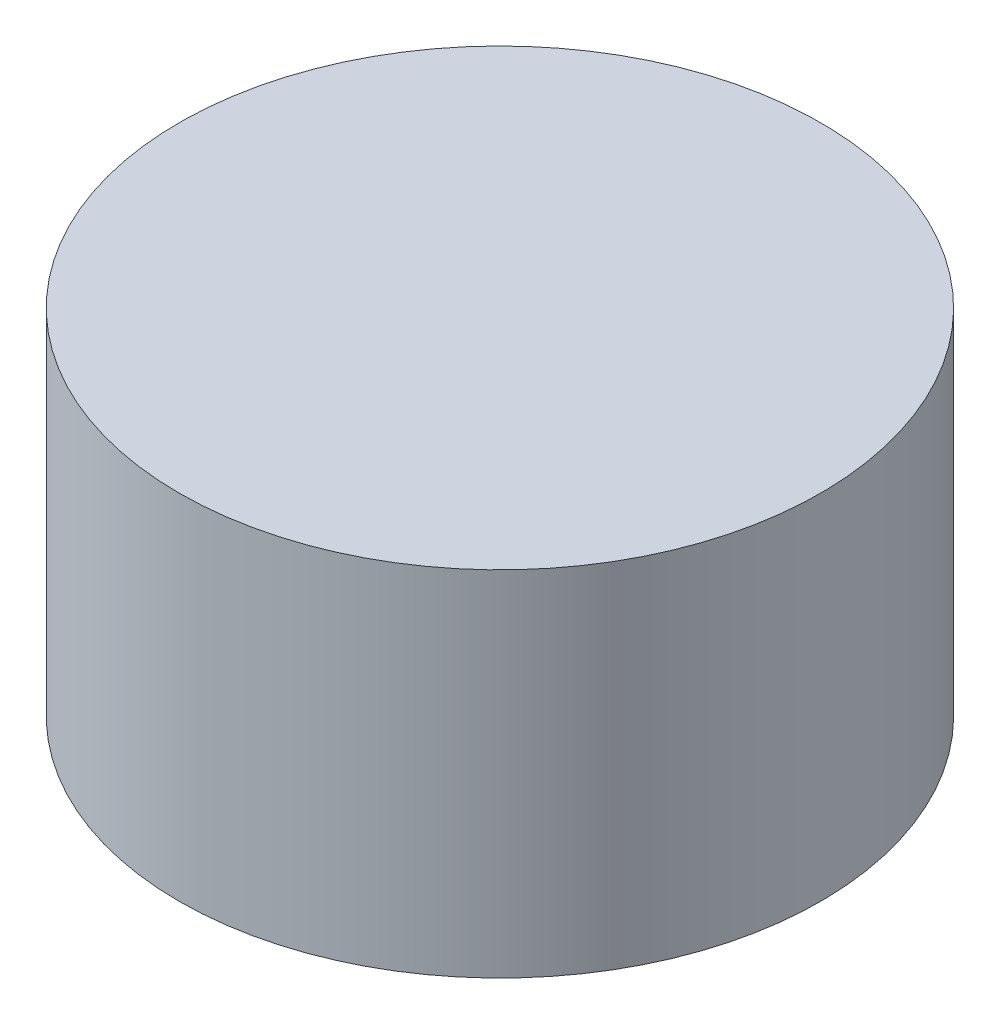
ISO-10303-21;
HEADER;
FILE_DESCRIPTION(('STEP AP214'),'2;1');
FILE_NAME('part.step','',(''),(''),'','','');
FILE_SCHEMA(('AUTOMOTIVE_DESIGN { 1 0 10303 214 1 1 1 1 }'));
ENDSEC;
DATA;
#1=APPLICATION_CONTEXT('core data for automotive mechanical design processes');
#2=APPLICATION_PROTOCOL_DEFINITION('international standard','automotive_design',2000,#1);
#3=PRODUCT_CONTEXT('',#1,'mechanical');
#4=PRODUCT('Part','Part','',(#3));
#5=PRODUCT_RELATED_PRODUCT_CATEGORY('part','',(#4));
#6=PRODUCT_DEFINITION_FORMATION('','',#4);
#7=PRODUCT_DEFINITION_CONTEXT('part definition',#1,'design');
#8=PRODUCT_DEFINITION('design','',#6,#7);
#9=PRODUCT_DEFINITION_SHAPE('','',#8);
#10=(LENGTH_UNIT() NAMED_UNIT(*) SI_UNIT(.MILLI.,.METRE.));
#11=(NAMED_UNIT(*) PLANE_ANGLE_UNIT() SI_UNIT($,.RADIAN.));
#12=(NAMED_UNIT(*) SI_UNIT($,.STERADIAN.) SOLID_ANGLE_UNIT());
#13=UNCERTAINTY_MEASURE_WITH_UNIT(LENGTH_MEASURE(1.E-05),#10,'distance_accuracy_value','');
#14=(GEOMETRIC_REPRESENTATION_CONTEXT(3) GLOBAL_UNCERTAINTY_ASSIGNED_CONTEXT((#13)) GLOBAL_UNIT_ASSIGNED_CONTEXT((#10,
#11,#12)) REPRESENTATION_CONTEXT('',''));
#15=CARTESIAN_POINT('',(0.,0.,0.));
#16=DIRECTION('',(0.,0.,1.));
#17=DIRECTION('',(1.,0.,0.));
#18=AXIS2_PLACEMENT_3D('',#15,#16,#17);
#19=CARTESIAN_POINT('',(0.,34.29,0.));
#20=DIRECTION('',(0.,-1.,0.));
#21=DIRECTION('',(0.,0.,-1.));
#22=AXIS2_PLACEMENT_3D('',#19,#20,#21);
#23=CYLINDRICAL_SURFACE('',#22,31.115);
#24=CARTESIAN_POINT('',(0.,34.29,0.));
#25=DIRECTION('',(0.,1.,0.));
#26=DIRECTION('',(0.,0.,1.));
#27=AXIS2_PLACEMENT_3D('',#24,#25,#26);
#28=CIRCLE('',#27,31.115);
#29=CARTESIAN_POINT('',(0.,34.29,31.115));
#30=VERTEX_POINT('',#29);
#31=EDGE_CURVE('E10',#30,#30,#28,.T.);
#32=ORIENTED_EDGE('',*,*,#31,.F.);
#33=EDGE_LOOP('',(#32));
#34=FACE_BOUND('',#33,.T.);
#35=CARTESIAN_POINT('',(0.,0.,0.));
#36=DIRECTION('',(0.,1.,0.));
#37=DIRECTION('',(0.,0.,1.));
#38=AXIS2_PLACEMENT_3D('',#35,#36,#37);
#39=CIRCLE('',#38,31.115);
#40=CARTESIAN_POINT('',(0.,0.,31.115));
#41=VERTEX_POINT('',#40);
#42=EDGE_CURVE('E38',#41,#41,#39,.T.);
#43=ORIENTED_EDGE('',*,*,#42,.T.);
#44=EDGE_LOOP('',(#43));
#45=FACE_BOUND('',#44,.T.);
#46=ADVANCED_FACE('F35',(#34,#45),#23,.T.);
#47=CARTESIAN_POINT('',(0.,34.29,0.));
#48=DIRECTION('',(0.,1.,0.));
#49=DIRECTION('',(0.,0.,1.));
#50=AXIS2_PLACEMENT_3D('',#47,#48,#49);
#51=PLANE('',#50);
#52=ORIENTED_EDGE('',*,*,#31,.T.);
#53=EDGE_LOOP('',(#52));
#54=FACE_BOUND('',#53,.T.);
#55=ADVANCED_FACE('F50',(#54),#51,.T.);
#56=CARTESIAN_POINT('',(0.,0.,0.));
#57=DIRECTION('',(0.,1.,0.));
#58=DIRECTION('',(0.,0.,1.));
#59=AXIS2_PLACEMENT_3D('',#56,#57,#58);
#60=PLANE('',#59);
#61=ORIENTED_EDGE('',*,*,#42,.F.);
#62=EDGE_LOOP('',(#61));
#63=FACE_BOUND('',#62,.T.);
#64=ADVANCED_FACE('F48',(#63),#60,.F.);
#65=CLOSED_SHELL('',(#46,#55,#64));
#66=MANIFOLD_SOLID_BREP('B2',#65);
#67=ADVANCED_BREP_SHAPE_REPRESENTATION('',(#18,#66),#14);
#68=SHAPE_DEFINITION_REPRESENTATION(#9,#67);
ENDSEC;
END-ISO-10303-21;
